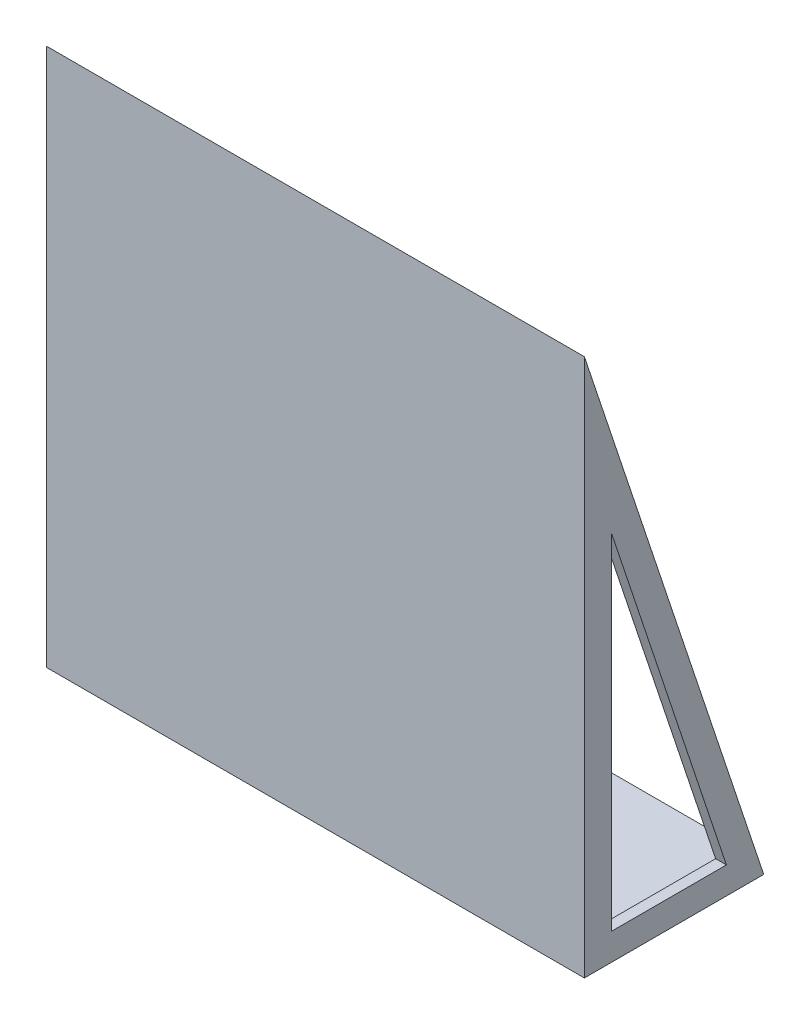
ISO-10303-21;
HEADER;
FILE_DESCRIPTION(('STEP AP214'),'2;1');
FILE_NAME('part.step','',(''),(''),'','','');
FILE_SCHEMA(('AUTOMOTIVE_DESIGN { 1 0 10303 214 1 1 1 1 }'));
ENDSEC;
DATA;
#1=APPLICATION_CONTEXT('core data for automotive mechanical design processes');
#2=APPLICATION_PROTOCOL_DEFINITION('international standard','automotive_design',2000,#1);
#3=PRODUCT_CONTEXT('',#1,'mechanical');
#4=PRODUCT('Part','Part','',(#3));
#5=PRODUCT_RELATED_PRODUCT_CATEGORY('part','',(#4));
#6=PRODUCT_DEFINITION_FORMATION('','',#4);
#7=PRODUCT_DEFINITION_CONTEXT('part definition',#1,'design');
#8=PRODUCT_DEFINITION('design','',#6,#7);
#9=PRODUCT_DEFINITION_SHAPE('','',#8);
#10=(LENGTH_UNIT() NAMED_UNIT(*) SI_UNIT(.MILLI.,.METRE.));
#11=(NAMED_UNIT(*) PLANE_ANGLE_UNIT() SI_UNIT($,.RADIAN.));
#12=(NAMED_UNIT(*) SI_UNIT($,.STERADIAN.) SOLID_ANGLE_UNIT());
#13=UNCERTAINTY_MEASURE_WITH_UNIT(LENGTH_MEASURE(1.E-05),#10,'distance_accuracy_value','');
#14=(GEOMETRIC_REPRESENTATION_CONTEXT(3) GLOBAL_UNCERTAINTY_ASSIGNED_CONTEXT((#13)) GLOBAL_UNIT_ASSIGNED_CONTEXT((#10,
#11,#12)) REPRESENTATION_CONTEXT('',''));
#15=CARTESIAN_POINT('',(0.,0.,0.));
#16=DIRECTION('',(0.,0.,1.));
#17=DIRECTION('',(1.,0.,0.));
#18=AXIS2_PLACEMENT_3D('',#15,#16,#17);
#19=CARTESIAN_POINT('',(0.15,0.15,-0.1));
#20=DIRECTION('',(1.,0.,0.));
#21=DIRECTION('',(0.,0.,-1.));
#22=AXIS2_PLACEMENT_3D('',#19,#20,#21);
#23=PLANE('',#22);
#24=DIRECTION('',(0.,0.,-1.));
#25=VECTOR('',#24,1.);
#26=CARTESIAN_POINT('',(0.15,-0.135,-0.1));
#27=LINE('',#26,#25);
#28=CARTESIAN_POINT('',(0.15,-0.135,-0.015));
#29=VERTEX_POINT('',#28);
#30=CARTESIAN_POINT('',(0.15,-0.135,-0.0791886116991581));
#31=VERTEX_POINT('',#30);
#32=EDGE_CURVE('E177',#29,#31,#27,.T.);
#33=ORIENTED_EDGE('',*,*,#32,.F.);
#34=DIRECTION('',(0.,-1.,0.));
#35=VECTOR('',#34,1.);
#36=CARTESIAN_POINT('',(0.15,0.15,-0.015));
#37=LINE('',#36,#35);
#38=CARTESIAN_POINT('',(0.15,0.0575658350974743,-0.015));
#39=VERTEX_POINT('',#38);
#40=EDGE_CURVE('E163',#39,#29,#37,.T.);
#41=ORIENTED_EDGE('',*,*,#40,.F.);
#42=DIRECTION('',(0.,0.948683298050514,0.316227766016838));
#43=VECTOR('',#42,1.);
#44=CARTESIAN_POINT('',(0.15,0.115256583509747,0.0042302494707577));
#45=LINE('',#44,#43);
#46=EDGE_CURVE('E170',#31,#39,#45,.T.);
#47=ORIENTED_EDGE('',*,*,#46,.F.);
#48=EDGE_LOOP('',(#33,#41,#47));
#49=FACE_BOUND('',#48,.T.);
#50=DIRECTION('',(0.,-0.948683298050514,-0.316227766016838));
#51=VECTOR('',#50,1.);
#52=CARTESIAN_POINT('',(0.15,0.12,-0.00999999999999998));
#53=LINE('',#52,#51);
#54=CARTESIAN_POINT('',(0.15,0.15,0.));
#55=VERTEX_POINT('',#54);
#56=CARTESIAN_POINT('',(0.15,-0.15,-0.1));
#57=VERTEX_POINT('',#56);
#58=EDGE_CURVE('E195',#55,#57,#53,.T.);
#59=ORIENTED_EDGE('',*,*,#58,.F.);
#60=DIRECTION('',(0.,1.,0.));
#61=VECTOR('',#60,1.);
#62=CARTESIAN_POINT('',(0.15,0.15,0.));
#63=LINE('',#62,#61);
#64=CARTESIAN_POINT('',(0.15,-0.15,0.));
#65=VERTEX_POINT('',#64);
#66=EDGE_CURVE('E214',#65,#55,#63,.T.);
#67=ORIENTED_EDGE('',*,*,#66,.F.);
#68=DIRECTION('',(0.,0.,1.));
#69=VECTOR('',#68,1.);
#70=CARTESIAN_POINT('',(0.15,-0.15,-0.1));
#71=LINE('',#70,#69);
#72=EDGE_CURVE('E238',#57,#65,#71,.T.);
#73=ORIENTED_EDGE('',*,*,#72,.F.);
#74=EDGE_LOOP('',(#59,#67,#73));
#75=FACE_BOUND('',#74,.T.);
#76=ADVANCED_FACE('F38',(#49,#75),#23,.T.);
#77=CARTESIAN_POINT('',(-0.15,-0.15,-0.1));
#78=DIRECTION('',(0.,-1.,0.));
#79=DIRECTION('',(0.,0.,-1.));
#80=AXIS2_PLACEMENT_3D('',#77,#78,#79);
#81=PLANE('',#80);
#82=DIRECTION('',(1.,0.,0.));
#83=VECTOR('',#82,1.);
#84=CARTESIAN_POINT('',(-0.15,-0.15,0.));
#85=LINE('',#84,#83);
#86=CARTESIAN_POINT('',(-0.15,-0.15,0.));
#87=VERTEX_POINT('',#86);
#88=EDGE_CURVE('E223',#87,#65,#85,.T.);
#89=ORIENTED_EDGE('',*,*,#88,.F.);
#90=DIRECTION('',(0.,0.,1.));
#91=VECTOR('',#90,1.);
#92=CARTESIAN_POINT('',(-0.15,-0.15,-0.1));
#93=LINE('',#92,#91);
#94=CARTESIAN_POINT('',(-0.15,-0.15,-0.1));
#95=VERTEX_POINT('',#94);
#96=EDGE_CURVE('E222',#95,#87,#93,.T.);
#97=ORIENTED_EDGE('',*,*,#96,.F.);
#98=DIRECTION('',(1.,0.,0.));
#99=VECTOR('',#98,1.);
#100=CARTESIAN_POINT('',(-0.15,-0.15,-0.1));
#101=LINE('',#100,#99);
#102=EDGE_CURVE('E218',#95,#57,#101,.T.);
#103=ORIENTED_EDGE('',*,*,#102,.T.);
#104=ORIENTED_EDGE('',*,*,#72,.T.);
#105=EDGE_LOOP('',(#89,#97,#103,#104));
#106=FACE_BOUND('',#105,.T.);
#107=ADVANCED_FACE('F266',(#106),#81,.T.);
#108=CARTESIAN_POINT('',(-0.15,0.15,-0.1));
#109=DIRECTION('',(-1.,0.,0.));
#110=DIRECTION('',(0.,0.,1.));
#111=AXIS2_PLACEMENT_3D('',#108,#109,#110);
#112=PLANE('',#111);
#113=DIRECTION('',(0.,0.,1.));
#114=VECTOR('',#113,1.);
#115=CARTESIAN_POINT('',(-0.15,-0.135,-0.0791886116991581));
#116=LINE('',#115,#114);
#117=CARTESIAN_POINT('',(-0.15,-0.135,-0.0791886116991581));
#118=VERTEX_POINT('',#117);
#119=CARTESIAN_POINT('',(-0.15,-0.135,-0.015));
#120=VERTEX_POINT('',#119);
#121=EDGE_CURVE('E61',#118,#120,#116,.T.);
#122=ORIENTED_EDGE('',*,*,#121,.F.);
#123=DIRECTION('',(0.,-0.948683298050514,-0.316227766016838));
#124=VECTOR('',#123,1.);
#125=CARTESIAN_POINT('',(-0.15,0.0575658350974743,-0.015));
#126=LINE('',#125,#124);
#127=CARTESIAN_POINT('',(-0.15,0.0575658350974743,-0.015));
#128=VERTEX_POINT('',#127);
#129=EDGE_CURVE('E133',#128,#118,#126,.T.);
#130=ORIENTED_EDGE('',*,*,#129,.F.);
#131=DIRECTION('',(0.,1.,0.));
#132=VECTOR('',#131,1.);
#133=CARTESIAN_POINT('',(-0.15,-0.135,-0.015));
#134=LINE('',#133,#132);
#135=EDGE_CURVE('E141',#120,#128,#134,.T.);
#136=ORIENTED_EDGE('',*,*,#135,.F.);
#137=EDGE_LOOP('',(#122,#130,#136));
#138=FACE_BOUND('',#137,.T.);
#139=DIRECTION('',(0.,0.948683298050514,0.316227766016838));
#140=VECTOR('',#139,1.);
#141=CARTESIAN_POINT('',(-0.15,-0.15,-0.1));
#142=LINE('',#141,#140);
#143=CARTESIAN_POINT('',(-0.15,0.15,0.));
#144=VERTEX_POINT('',#143);
#145=EDGE_CURVE('E180',#95,#144,#142,.T.);
#146=ORIENTED_EDGE('',*,*,#145,.F.);
#147=ORIENTED_EDGE('',*,*,#96,.T.);
#148=DIRECTION('',(0.,-1.,0.));
#149=VECTOR('',#148,1.);
#150=CARTESIAN_POINT('',(-0.15,0.15,0.));
#151=LINE('',#150,#149);
#152=EDGE_CURVE('E231',#144,#87,#151,.T.);
#153=ORIENTED_EDGE('',*,*,#152,.F.);
#154=EDGE_LOOP('',(#146,#147,#153));
#155=FACE_BOUND('',#154,.T.);
#156=ADVANCED_FACE('F147',(#138,#155),#112,.T.);
#157=CARTESIAN_POINT('',(0.,0.,0.));
#158=DIRECTION('',(0.,0.,1.));
#159=DIRECTION('',(1.,0.,0.));
#160=AXIS2_PLACEMENT_3D('',#157,#158,#159);
#161=PLANE('',#160);
#162=ORIENTED_EDGE('',*,*,#66,.T.);
#163=DIRECTION('',(-1.,0.,0.));
#164=VECTOR('',#163,1.);
#165=CARTESIAN_POINT('',(-0.15,0.15,0.));
#166=LINE('',#165,#164);
#167=EDGE_CURVE('E227',#55,#144,#166,.T.);
#168=ORIENTED_EDGE('',*,*,#167,.T.);
#169=ORIENTED_EDGE('',*,*,#152,.T.);
#170=ORIENTED_EDGE('',*,*,#88,.T.);
#171=EDGE_LOOP('',(#162,#168,#169,#170));
#172=FACE_BOUND('',#171,.T.);
#173=ADVANCED_FACE('F282',(#172),#161,.T.);
#174=CARTESIAN_POINT('',(0.1591,-0.15,-0.1));
#175=DIRECTION('',(0.,-0.316227766016838,0.948683298050514));
#176=DIRECTION('',(0.,-0.948683298050514,-0.316227766016838));
#177=AXIS2_PLACEMENT_3D('',#174,#175,#176);
#178=PLANE('',#177);
#179=ORIENTED_EDGE('',*,*,#58,.T.);
#180=ORIENTED_EDGE('',*,*,#102,.F.);
#181=ORIENTED_EDGE('',*,*,#145,.T.);
#182=ORIENTED_EDGE('',*,*,#167,.F.);
#183=EDGE_LOOP('',(#179,#180,#181,#182));
#184=FACE_BOUND('',#183,.T.);
#185=DIRECTION('',(0.,0.948683298050514,0.316227766016838));
#186=VECTOR('',#185,1.);
#187=CARTESIAN_POINT('',(-0.144,-0.141,-0.097));
#188=LINE('',#187,#186);
#189=CARTESIAN_POINT('',(-0.144,-0.14,-0.0966666666666667));
#190=VERTEX_POINT('',#189);
#191=CARTESIAN_POINT('',(-0.144,0.132,-0.00600000000000001));
#192=VERTEX_POINT('',#191);
#193=EDGE_CURVE('E187',#190,#192,#188,.T.);
#194=ORIENTED_EDGE('',*,*,#193,.F.);
#195=DIRECTION('',(1.,0.,0.));
#196=VECTOR('',#195,1.);
#197=CARTESIAN_POINT('',(0.,-0.14,-0.0966666666666667));
#198=LINE('',#197,#196);
#199=CARTESIAN_POINT('',(0.144,-0.14,-0.0966666666666667));
#200=VERTEX_POINT('',#199);
#201=EDGE_CURVE('E241',#190,#200,#198,.T.);
#202=ORIENTED_EDGE('',*,*,#201,.T.);
#203=DIRECTION('',(0.,-0.948683298050514,-0.316227766016838));
#204=VECTOR('',#203,1.);
#205=CARTESIAN_POINT('',(0.144,-0.141,-0.097));
#206=LINE('',#205,#204);
#207=CARTESIAN_POINT('',(0.144,0.132,-0.00600000000000001));
#208=VERTEX_POINT('',#207);
#209=EDGE_CURVE('E183',#208,#200,#206,.T.);
#210=ORIENTED_EDGE('',*,*,#209,.F.);
#211=DIRECTION('',(1.,0.,0.));
#212=VECTOR('',#211,1.);
#213=CARTESIAN_POINT('',(-0.144,0.132,-0.006));
#214=LINE('',#213,#212);
#215=EDGE_CURVE('E191',#192,#208,#214,.T.);
#216=ORIENTED_EDGE('',*,*,#215,.F.);
#217=EDGE_LOOP('',(#194,#202,#210,#216));
#218=FACE_BOUND('',#217,.T.);
#219=ADVANCED_FACE('F287',(#184,#218),#178,.F.);
#220=CARTESIAN_POINT('',(0.,-0.14,0.));
#221=DIRECTION('',(0.,1.,0.));
#222=DIRECTION('',(0.,0.,1.));
#223=AXIS2_PLACEMENT_3D('',#220,#221,#222);
#224=PLANE('',#223);
#225=ORIENTED_EDGE('',*,*,#201,.F.);
#226=DIRECTION('',(0.,0.,1.));
#227=VECTOR('',#226,1.);
#228=CARTESIAN_POINT('',(-0.144,-0.14,-0.1));
#229=LINE('',#228,#227);
#230=CARTESIAN_POINT('',(-0.144,-0.14,-0.006));
#231=VERTEX_POINT('',#230);
#232=EDGE_CURVE('E198',#190,#231,#229,.T.);
#233=ORIENTED_EDGE('',*,*,#232,.T.);
#234=DIRECTION('',(1.,0.,0.));
#235=VECTOR('',#234,1.);
#236=CARTESIAN_POINT('',(-0.144,-0.14,-0.006));
#237=LINE('',#236,#235);
#238=CARTESIAN_POINT('',(0.144,-0.14,-0.006));
#239=VERTEX_POINT('',#238);
#240=EDGE_CURVE('E201',#231,#239,#237,.T.);
#241=ORIENTED_EDGE('',*,*,#240,.T.);
#242=DIRECTION('',(0.,0.,-1.));
#243=VECTOR('',#242,1.);
#244=CARTESIAN_POINT('',(0.144,-0.14,-0.1));
#245=LINE('',#244,#243);
#246=EDGE_CURVE('E205',#239,#200,#245,.T.);
#247=ORIENTED_EDGE('',*,*,#246,.T.);
#248=EDGE_LOOP('',(#225,#233,#241,#247));
#249=FACE_BOUND('',#248,.T.);
#250=ADVANCED_FACE('F301',(#249),#224,.T.);
#251=CARTESIAN_POINT('',(-0.144,-0.14,-0.006));
#252=DIRECTION('',(0.,0.,1.));
#253=DIRECTION('',(1.,0.,0.));
#254=AXIS2_PLACEMENT_3D('',#251,#252,#253);
#255=PLANE('',#254);
#256=DIRECTION('',(0.,1.,0.));
#257=VECTOR('',#256,1.);
#258=CARTESIAN_POINT('',(-0.144,-0.14,-0.006));
#259=LINE('',#258,#257);
#260=EDGE_CURVE('E209',#231,#192,#259,.T.);
#261=ORIENTED_EDGE('',*,*,#260,.T.);
#262=ORIENTED_EDGE('',*,*,#215,.T.);
#263=DIRECTION('',(0.,1.,0.));
#264=VECTOR('',#263,1.);
#265=CARTESIAN_POINT('',(0.144,-0.14,-0.006));
#266=LINE('',#265,#264);
#267=EDGE_CURVE('E210',#239,#208,#266,.T.);
#268=ORIENTED_EDGE('',*,*,#267,.F.);
#269=ORIENTED_EDGE('',*,*,#240,.F.);
#270=EDGE_LOOP('',(#261,#262,#268,#269));
#271=FACE_BOUND('',#270,.T.);
#272=ADVANCED_FACE('F298',(#271),#255,.F.);
#273=CARTESIAN_POINT('',(0.144,-0.14,-0.1));
#274=DIRECTION('',(1.,0.,0.));
#275=DIRECTION('',(0.,0.,-1.));
#276=AXIS2_PLACEMENT_3D('',#273,#274,#275);
#277=PLANE('',#276);
#278=DIRECTION('',(0.,-1.,0.));
#279=VECTOR('',#278,1.);
#280=CARTESIAN_POINT('',(0.144,-0.14,-0.015));
#281=LINE('',#280,#279);
#282=CARTESIAN_POINT('',(0.144,0.0575658350974743,-0.015));
#283=VERTEX_POINT('',#282);
#284=CARTESIAN_POINT('',(0.144,-0.135,-0.015));
#285=VERTEX_POINT('',#284);
#286=EDGE_CURVE('E159',#283,#285,#281,.T.);
#287=ORIENTED_EDGE('',*,*,#286,.T.);
#288=DIRECTION('',(0.,0.,-1.));
#289=VECTOR('',#288,1.);
#290=CARTESIAN_POINT('',(0.144,-0.135,-0.1));
#291=LINE('',#290,#289);
#292=CARTESIAN_POINT('',(0.144,-0.135,-0.0791886116991581));
#293=VERTEX_POINT('',#292);
#294=EDGE_CURVE('E173',#285,#293,#291,.T.);
#295=ORIENTED_EDGE('',*,*,#294,.T.);
#296=DIRECTION('',(0.,0.948683298050514,0.316227766016838));
#297=VECTOR('',#296,1.);
#298=CARTESIAN_POINT('',(0.144,-0.145743416490253,-0.0827697505292423));
#299=LINE('',#298,#297);
#300=EDGE_CURVE('E166',#293,#283,#299,.T.);
#301=ORIENTED_EDGE('',*,*,#300,.T.);
#302=EDGE_LOOP('',(#287,#295,#301));
#303=FACE_BOUND('',#302,.T.);
#304=ORIENTED_EDGE('',*,*,#267,.T.);
#305=ORIENTED_EDGE('',*,*,#209,.T.);
#306=ORIENTED_EDGE('',*,*,#246,.F.);
#307=EDGE_LOOP('',(#304,#305,#306));
#308=FACE_BOUND('',#307,.T.);
#309=ADVANCED_FACE('F297',(#303,#308),#277,.F.);
#310=CARTESIAN_POINT('',(-0.144,-0.14,-0.1));
#311=DIRECTION('',(-1.,0.,0.));
#312=DIRECTION('',(0.,0.,1.));
#313=AXIS2_PLACEMENT_3D('',#310,#311,#312);
#314=PLANE('',#313);
#315=DIRECTION('',(0.,-0.948683298050514,-0.316227766016838));
#316=VECTOR('',#315,1.);
#317=CARTESIAN_POINT('',(-0.144,-0.145743416490253,-0.0827697505292423));
#318=LINE('',#317,#316);
#319=CARTESIAN_POINT('',(-0.144,0.0575658350974743,-0.015));
#320=VERTEX_POINT('',#319);
#321=CARTESIAN_POINT('',(-0.144,-0.135,-0.0791886116991581));
#322=VERTEX_POINT('',#321);
#323=EDGE_CURVE('E46',#320,#322,#318,.T.);
#324=ORIENTED_EDGE('',*,*,#323,.T.);
#325=DIRECTION('',(0.,0.,1.));
#326=VECTOR('',#325,1.);
#327=CARTESIAN_POINT('',(-0.144,-0.135,-0.1));
#328=LINE('',#327,#326);
#329=CARTESIAN_POINT('',(-0.144,-0.135,-0.015));
#330=VERTEX_POINT('',#329);
#331=EDGE_CURVE('E11',#322,#330,#328,.T.);
#332=ORIENTED_EDGE('',*,*,#331,.T.);
#333=DIRECTION('',(0.,1.,0.));
#334=VECTOR('',#333,1.);
#335=CARTESIAN_POINT('',(-0.144,-0.14,-0.015));
#336=LINE('',#335,#334);
#337=EDGE_CURVE('E246',#330,#320,#336,.T.);
#338=ORIENTED_EDGE('',*,*,#337,.T.);
#339=EDGE_LOOP('',(#324,#332,#338));
#340=FACE_BOUND('',#339,.T.);
#341=ORIENTED_EDGE('',*,*,#232,.F.);
#342=ORIENTED_EDGE('',*,*,#193,.T.);
#343=ORIENTED_EDGE('',*,*,#260,.F.);
#344=EDGE_LOOP('',(#341,#342,#343));
#345=FACE_BOUND('',#344,.T.);
#346=ADVANCED_FACE('F250',(#340,#345),#314,.F.);
#347=CARTESIAN_POINT('',(0.1591,-0.135,-0.015));
#348=DIRECTION('',(0.,0.,1.));
#349=DIRECTION('',(1.,0.,0.));
#350=AXIS2_PLACEMENT_3D('',#347,#348,#349);
#351=PLANE('',#350);
#352=DIRECTION('',(-1.,0.,0.));
#353=VECTOR('',#352,1.);
#354=CARTESIAN_POINT('',(0.1591,-0.135,-0.015));
#355=LINE('',#354,#353);
#356=EDGE_CURVE('E143',#330,#120,#355,.T.);
#357=ORIENTED_EDGE('',*,*,#356,.T.);
#358=ORIENTED_EDGE('',*,*,#135,.T.);
#359=DIRECTION('',(-1.,0.,0.));
#360=VECTOR('',#359,1.);
#361=CARTESIAN_POINT('',(0.1591,0.0575658350974743,-0.015));
#362=LINE('',#361,#360);
#363=EDGE_CURVE('E128',#320,#128,#362,.T.);
#364=ORIENTED_EDGE('',*,*,#363,.F.);
#365=ORIENTED_EDGE('',*,*,#337,.F.);
#366=EDGE_LOOP('',(#357,#358,#364,#365));
#367=FACE_BOUND('',#366,.T.);
#368=ADVANCED_FACE('F142',(#367),#351,.F.);
#369=CARTESIAN_POINT('',(0.1591,0.0575658350974743,-0.015));
#370=DIRECTION('',(0.,0.316227766016838,-0.948683298050514));
#371=DIRECTION('',(0.,0.948683298050514,0.316227766016838));
#372=AXIS2_PLACEMENT_3D('',#369,#370,#371);
#373=PLANE('',#372);
#374=ORIENTED_EDGE('',*,*,#363,.T.);
#375=ORIENTED_EDGE('',*,*,#129,.T.);
#376=DIRECTION('',(-1.,0.,0.));
#377=VECTOR('',#376,1.);
#378=CARTESIAN_POINT('',(0.1591,-0.135,-0.0791886116991581));
#379=LINE('',#378,#377);
#380=EDGE_CURVE('E155',#322,#118,#379,.T.);
#381=ORIENTED_EDGE('',*,*,#380,.F.);
#382=ORIENTED_EDGE('',*,*,#323,.F.);
#383=EDGE_LOOP('',(#374,#375,#381,#382));
#384=FACE_BOUND('',#383,.T.);
#385=ADVANCED_FACE('F130',(#384),#373,.F.);
#386=CARTESIAN_POINT('',(0.1591,-0.135,-0.0791886116991581));
#387=DIRECTION('',(0.,-1.,0.));
#388=DIRECTION('',(0.,0.,-1.));
#389=AXIS2_PLACEMENT_3D('',#386,#387,#388);
#390=PLANE('',#389);
#391=ORIENTED_EDGE('',*,*,#380,.T.);
#392=ORIENTED_EDGE('',*,*,#121,.T.);
#393=ORIENTED_EDGE('',*,*,#356,.F.);
#394=ORIENTED_EDGE('',*,*,#331,.F.);
#395=EDGE_LOOP('',(#391,#392,#393,#394));
#396=FACE_BOUND('',#395,.T.);
#397=ADVANCED_FACE('F252',(#396),#390,.F.);
#398=ORIENTED_EDGE('',*,*,#32,.T.);
#399=EDGE_CURVE('E157',#31,#293,#379,.T.);
#400=ORIENTED_EDGE('',*,*,#399,.T.);
#401=ORIENTED_EDGE('',*,*,#294,.F.);
#402=EDGE_CURVE('E138',#29,#285,#355,.T.);
#403=ORIENTED_EDGE('',*,*,#402,.F.);
#404=EDGE_LOOP('',(#398,#400,#401,#403));
#405=FACE_BOUND('',#404,.T.);
#406=ADVANCED_FACE('F254',(#405),#390,.F.);
#407=ORIENTED_EDGE('',*,*,#46,.T.);
#408=EDGE_CURVE('E53',#39,#283,#362,.T.);
#409=ORIENTED_EDGE('',*,*,#408,.T.);
#410=ORIENTED_EDGE('',*,*,#300,.F.);
#411=ORIENTED_EDGE('',*,*,#399,.F.);
#412=EDGE_LOOP('',(#407,#409,#410,#411));
#413=FACE_BOUND('',#412,.T.);
#414=ADVANCED_FACE('F260',(#413),#373,.F.);
#415=ORIENTED_EDGE('',*,*,#40,.T.);
#416=ORIENTED_EDGE('',*,*,#402,.T.);
#417=ORIENTED_EDGE('',*,*,#286,.F.);
#418=ORIENTED_EDGE('',*,*,#408,.F.);
#419=EDGE_LOOP('',(#415,#416,#417,#418));
#420=FACE_BOUND('',#419,.T.);
#421=ADVANCED_FACE('F334',(#420),#351,.F.);
#422=CLOSED_SHELL('',(#76,#107,#156,#173,#219,#250,#272,#309,#346,#368,#385,#397,#406,#414,#421));
#423=MANIFOLD_SOLID_BREP('B2',#422);
#424=ADVANCED_BREP_SHAPE_REPRESENTATION('',(#18,#423),#14);
#425=SHAPE_DEFINITION_REPRESENTATION(#9,#424);
ENDSEC;
END-ISO-10303-21;
